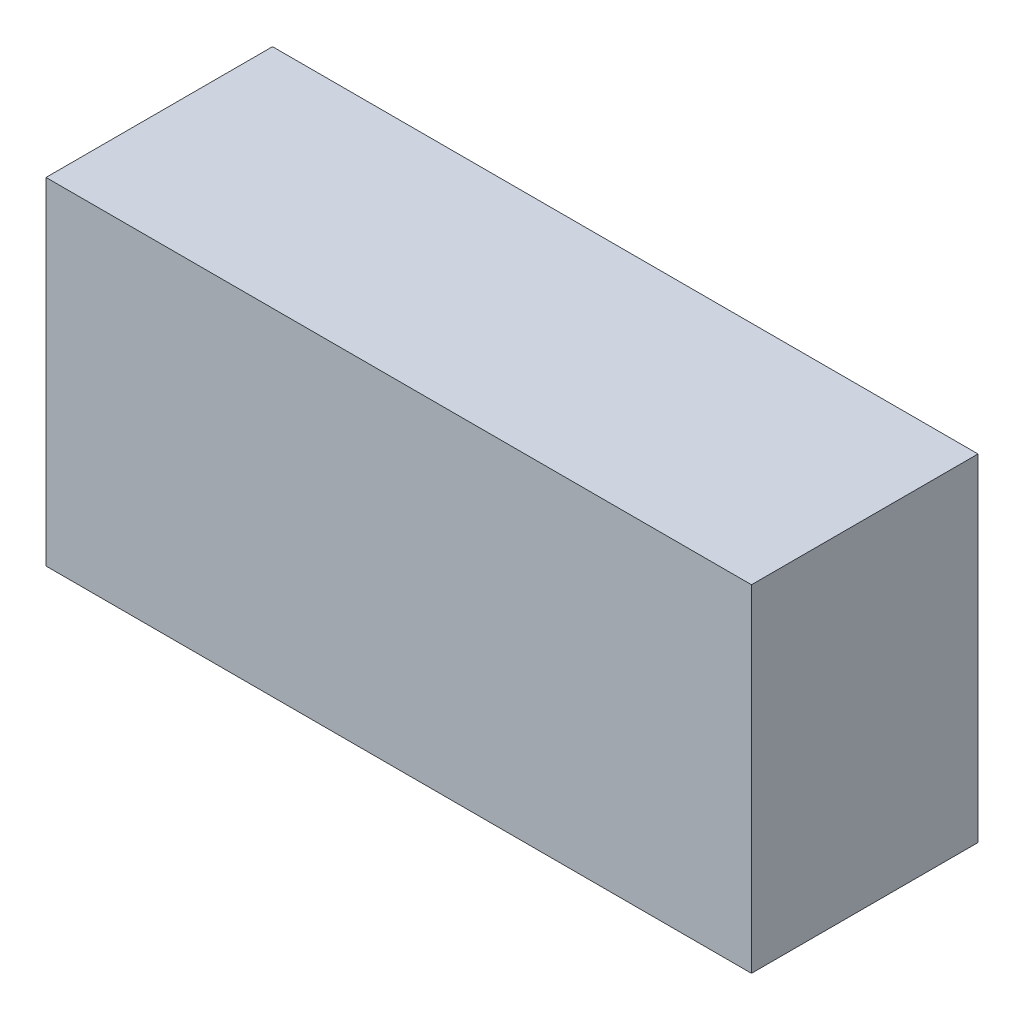
ISO-10303-21;
HEADER;
FILE_DESCRIPTION(('STEP AP214'),'2;1');
FILE_NAME('part.step','',(''),(''),'','','');
FILE_SCHEMA(('AUTOMOTIVE_DESIGN { 1 0 10303 214 1 1 1 1 }'));
ENDSEC;
DATA;
#1=APPLICATION_CONTEXT('core data for automotive mechanical design processes');
#2=APPLICATION_PROTOCOL_DEFINITION('international standard','automotive_design',2000,#1);
#3=PRODUCT_CONTEXT('',#1,'mechanical');
#4=PRODUCT('Part','Part','',(#3));
#5=PRODUCT_RELATED_PRODUCT_CATEGORY('part','',(#4));
#6=PRODUCT_DEFINITION_FORMATION('','',#4);
#7=PRODUCT_DEFINITION_CONTEXT('part definition',#1,'design');
#8=PRODUCT_DEFINITION('design','',#6,#7);
#9=PRODUCT_DEFINITION_SHAPE('','',#8);
#10=(LENGTH_UNIT() NAMED_UNIT(*) SI_UNIT(.MILLI.,.METRE.));
#11=(NAMED_UNIT(*) PLANE_ANGLE_UNIT() SI_UNIT($,.RADIAN.));
#12=(NAMED_UNIT(*) SI_UNIT($,.STERADIAN.) SOLID_ANGLE_UNIT());
#13=UNCERTAINTY_MEASURE_WITH_UNIT(LENGTH_MEASURE(1.E-05),#10,'distance_accuracy_value','');
#14=(GEOMETRIC_REPRESENTATION_CONTEXT(3) GLOBAL_UNCERTAINTY_ASSIGNED_CONTEXT((#13)) GLOBAL_UNIT_ASSIGNED_CONTEXT((#10,
#11,#12)) REPRESENTATION_CONTEXT('',''));
#15=CARTESIAN_POINT('',(0.,0.,0.));
#16=DIRECTION('',(0.,0.,1.));
#17=DIRECTION('',(1.,0.,0.));
#18=AXIS2_PLACEMENT_3D('',#15,#16,#17);
#19=CARTESIAN_POINT('',(109.,52.,0.));
#20=DIRECTION('',(0.,0.,-1.));
#21=DIRECTION('',(-1.,0.,0.));
#22=AXIS2_PLACEMENT_3D('',#19,#20,#21);
#23=PLANE('',#22);
#24=DIRECTION('',(1.,0.,0.));
#25=VECTOR('',#24,1.);
#26=CARTESIAN_POINT('',(109.,0.,0.));
#27=LINE('',#26,#25);
#28=CARTESIAN_POINT('',(0.,0.,0.));
#29=VERTEX_POINT('',#28);
#30=CARTESIAN_POINT('',(109.,0.,0.));
#31=VERTEX_POINT('',#30);
#32=EDGE_CURVE('E104',#29,#31,#27,.T.);
#33=ORIENTED_EDGE('',*,*,#32,.T.);
#34=DIRECTION('',(0.,-1.,0.));
#35=VECTOR('',#34,1.);
#36=CARTESIAN_POINT('',(109.,52.,0.));
#37=LINE('',#36,#35);
#38=CARTESIAN_POINT('',(109.,52.,0.));
#39=VERTEX_POINT('',#38);
#40=EDGE_CURVE('E11',#39,#31,#37,.T.);
#41=ORIENTED_EDGE('',*,*,#40,.F.);
#42=DIRECTION('',(1.,0.,0.));
#43=VECTOR('',#42,1.);
#44=CARTESIAN_POINT('',(109.,52.,0.));
#45=LINE('',#44,#43);
#46=CARTESIAN_POINT('',(0.,52.,0.));
#47=VERTEX_POINT('',#46);
#48=EDGE_CURVE('E92',#47,#39,#45,.T.);
#49=ORIENTED_EDGE('',*,*,#48,.F.);
#50=DIRECTION('',(0.,-1.,0.));
#51=VECTOR('',#50,1.);
#52=CARTESIAN_POINT('',(0.,52.,0.));
#53=LINE('',#52,#51);
#54=EDGE_CURVE('E100',#47,#29,#53,.T.);
#55=ORIENTED_EDGE('',*,*,#54,.T.);
#56=EDGE_LOOP('',(#33,#41,#49,#55));
#57=FACE_BOUND('',#56,.T.);
#58=ADVANCED_FACE('F41',(#57),#23,.F.);
#59=CARTESIAN_POINT('',(109.,52.,-35.));
#60=DIRECTION('',(-1.,0.,0.));
#61=DIRECTION('',(0.,0.,1.));
#62=AXIS2_PLACEMENT_3D('',#59,#60,#61);
#63=PLANE('',#62);
#64=DIRECTION('',(0.,0.,-1.));
#65=VECTOR('',#64,1.);
#66=CARTESIAN_POINT('',(109.,0.,-35.));
#67=LINE('',#66,#65);
#68=CARTESIAN_POINT('',(109.,0.,-35.));
#69=VERTEX_POINT('',#68);
#70=EDGE_CURVE('E96',#31,#69,#67,.T.);
#71=ORIENTED_EDGE('',*,*,#70,.T.);
#72=DIRECTION('',(0.,-1.,0.));
#73=VECTOR('',#72,1.);
#74=CARTESIAN_POINT('',(109.,52.,-35.));
#75=LINE('',#74,#73);
#76=CARTESIAN_POINT('',(109.,52.,-35.));
#77=VERTEX_POINT('',#76);
#78=EDGE_CURVE('E49',#77,#69,#75,.T.);
#79=ORIENTED_EDGE('',*,*,#78,.F.);
#80=DIRECTION('',(0.,0.,-1.));
#81=VECTOR('',#80,1.);
#82=CARTESIAN_POINT('',(109.,52.,-35.));
#83=LINE('',#82,#81);
#84=EDGE_CURVE('E87',#39,#77,#83,.T.);
#85=ORIENTED_EDGE('',*,*,#84,.F.);
#86=ORIENTED_EDGE('',*,*,#40,.T.);
#87=EDGE_LOOP('',(#71,#79,#85,#86));
#88=FACE_BOUND('',#87,.T.);
#89=ADVANCED_FACE('F95',(#88),#63,.F.);
#90=CARTESIAN_POINT('',(0.,52.,-35.));
#91=DIRECTION('',(0.,0.,1.));
#92=DIRECTION('',(1.,0.,0.));
#93=AXIS2_PLACEMENT_3D('',#90,#91,#92);
#94=PLANE('',#93);
#95=DIRECTION('',(-1.,0.,0.));
#96=VECTOR('',#95,1.);
#97=CARTESIAN_POINT('',(0.,0.,-35.));
#98=LINE('',#97,#96);
#99=CARTESIAN_POINT('',(0.,0.,-35.));
#100=VERTEX_POINT('',#99);
#101=EDGE_CURVE('E74',#69,#100,#98,.T.);
#102=ORIENTED_EDGE('',*,*,#101,.T.);
#103=DIRECTION('',(0.,-1.,0.));
#104=VECTOR('',#103,1.);
#105=CARTESIAN_POINT('',(0.,52.,-35.));
#106=LINE('',#105,#104);
#107=CARTESIAN_POINT('',(0.,52.,-35.));
#108=VERTEX_POINT('',#107);
#109=EDGE_CURVE('E97',#108,#100,#106,.T.);
#110=ORIENTED_EDGE('',*,*,#109,.F.);
#111=DIRECTION('',(-1.,0.,0.));
#112=VECTOR('',#111,1.);
#113=CARTESIAN_POINT('',(0.,52.,-35.));
#114=LINE('',#113,#112);
#115=EDGE_CURVE('E90',#77,#108,#114,.T.);
#116=ORIENTED_EDGE('',*,*,#115,.F.);
#117=ORIENTED_EDGE('',*,*,#78,.T.);
#118=EDGE_LOOP('',(#102,#110,#116,#117));
#119=FACE_BOUND('',#118,.T.);
#120=ADVANCED_FACE('F98',(#119),#94,.F.);
#121=CARTESIAN_POINT('',(0.,52.,0.));
#122=DIRECTION('',(1.,0.,0.));
#123=DIRECTION('',(0.,0.,-1.));
#124=AXIS2_PLACEMENT_3D('',#121,#122,#123);
#125=PLANE('',#124);
#126=DIRECTION('',(0.,0.,1.));
#127=VECTOR('',#126,1.);
#128=CARTESIAN_POINT('',(0.,0.,0.));
#129=LINE('',#128,#127);
#130=EDGE_CURVE('E80',#100,#29,#129,.T.);
#131=ORIENTED_EDGE('',*,*,#130,.T.);
#132=ORIENTED_EDGE('',*,*,#54,.F.);
#133=DIRECTION('',(0.,0.,1.));
#134=VECTOR('',#133,1.);
#135=CARTESIAN_POINT('',(0.,52.,0.));
#136=LINE('',#135,#134);
#137=EDGE_CURVE('E57',#108,#47,#136,.T.);
#138=ORIENTED_EDGE('',*,*,#137,.F.);
#139=ORIENTED_EDGE('',*,*,#109,.T.);
#140=EDGE_LOOP('',(#131,#132,#138,#139));
#141=FACE_BOUND('',#140,.T.);
#142=ADVANCED_FACE('F111',(#141),#125,.F.);
#143=CARTESIAN_POINT('',(0.,52.,0.));
#144=DIRECTION('',(0.,-1.,0.));
#145=DIRECTION('',(0.,0.,-1.));
#146=AXIS2_PLACEMENT_3D('',#143,#144,#145);
#147=PLANE('',#146);
#148=ORIENTED_EDGE('',*,*,#48,.T.);
#149=ORIENTED_EDGE('',*,*,#84,.T.);
#150=ORIENTED_EDGE('',*,*,#115,.T.);
#151=ORIENTED_EDGE('',*,*,#137,.T.);
#152=EDGE_LOOP('',(#148,#149,#150,#151));
#153=FACE_BOUND('',#152,.T.);
#154=ADVANCED_FACE('F88',(#153),#147,.F.);
#155=CARTESIAN_POINT('',(0.,0.,0.));
#156=DIRECTION('',(0.,-1.,0.));
#157=DIRECTION('',(0.,0.,-1.));
#158=AXIS2_PLACEMENT_3D('',#155,#156,#157);
#159=PLANE('',#158);
#160=ORIENTED_EDGE('',*,*,#32,.F.);
#161=ORIENTED_EDGE('',*,*,#130,.F.);
#162=ORIENTED_EDGE('',*,*,#101,.F.);
#163=ORIENTED_EDGE('',*,*,#70,.F.);
#164=EDGE_LOOP('',(#160,#161,#162,#163));
#165=FACE_BOUND('',#164,.T.);
#166=ADVANCED_FACE('F114',(#165),#159,.T.);
#167=CLOSED_SHELL('',(#58,#89,#120,#142,#154,#166));
#168=MANIFOLD_SOLID_BREP('B2',#167);
#169=ADVANCED_BREP_SHAPE_REPRESENTATION('',(#18,#168),#14);
#170=SHAPE_DEFINITION_REPRESENTATION(#9,#169);
ENDSEC;
END-ISO-10303-21;
